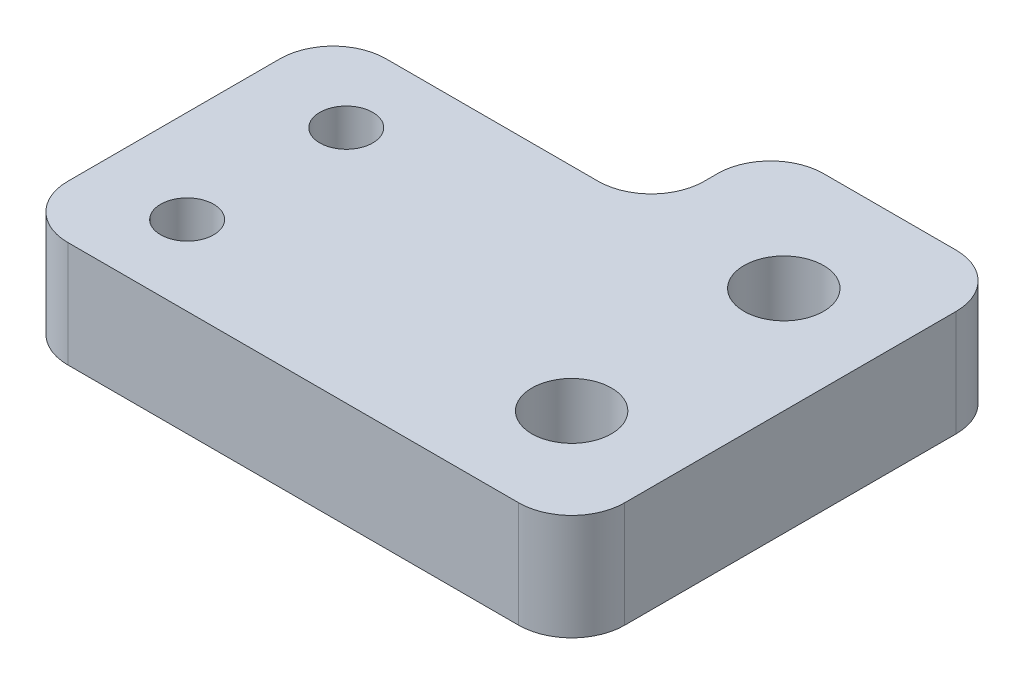
ISO-10303-21;
HEADER;
FILE_DESCRIPTION(('STEP AP214'),'2;1');
FILE_NAME('part.step','',(''),(''),'','','');
FILE_SCHEMA(('AUTOMOTIVE_DESIGN { 1 0 10303 214 1 1 1 1 }'));
ENDSEC;
DATA;
#1=APPLICATION_CONTEXT('core data for automotive mechanical design processes');
#2=APPLICATION_PROTOCOL_DEFINITION('international standard','automotive_design',2000,#1);
#3=PRODUCT_CONTEXT('',#1,'mechanical');
#4=PRODUCT('Part','Part','',(#3));
#5=PRODUCT_RELATED_PRODUCT_CATEGORY('part','',(#4));
#6=PRODUCT_DEFINITION_FORMATION('','',#4);
#7=PRODUCT_DEFINITION_CONTEXT('part definition',#1,'design');
#8=PRODUCT_DEFINITION('design','',#6,#7);
#9=PRODUCT_DEFINITION_SHAPE('','',#8);
#10=(LENGTH_UNIT() NAMED_UNIT(*) SI_UNIT(.MILLI.,.METRE.));
#11=(NAMED_UNIT(*) PLANE_ANGLE_UNIT() SI_UNIT($,.RADIAN.));
#12=(NAMED_UNIT(*) SI_UNIT($,.STERADIAN.) SOLID_ANGLE_UNIT());
#13=UNCERTAINTY_MEASURE_WITH_UNIT(LENGTH_MEASURE(1.E-05),#10,'distance_accuracy_value','');
#14=(GEOMETRIC_REPRESENTATION_CONTEXT(3) GLOBAL_UNCERTAINTY_ASSIGNED_CONTEXT((#13)) GLOBAL_UNIT_ASSIGNED_CONTEXT((#10,
#11,#12)) REPRESENTATION_CONTEXT('',''));
#15=CARTESIAN_POINT('',(0.,0.,0.));
#16=DIRECTION('',(0.,0.,1.));
#17=DIRECTION('',(1.,0.,0.));
#18=AXIS2_PLACEMENT_3D('',#15,#16,#17);
#19=CARTESIAN_POINT('',(-2.5,4.,0.));
#20=DIRECTION('',(-1.,0.,0.));
#21=DIRECTION('',(0.,0.,1.));
#22=AXIS2_PLACEMENT_3D('',#19,#20,#21);
#23=PLANE('',#22);
#24=DIRECTION('',(0.,0.,-1.));
#25=VECTOR('',#24,1.);
#26=CARTESIAN_POINT('',(-2.5,4.,0.));
#27=LINE('',#26,#25);
#28=CARTESIAN_POINT('',(-2.5,4.,-5.5));
#29=VERTEX_POINT('',#28);
#30=CARTESIAN_POINT('',(-2.5,4.,-6.));
#31=VERTEX_POINT('',#30);
#32=EDGE_CURVE('E179',#29,#31,#27,.T.);
#33=ORIENTED_EDGE('',*,*,#32,.T.);
#34=DIRECTION('',(0.,1.,0.));
#35=VECTOR('',#34,1.);
#36=CARTESIAN_POINT('',(-2.5,0.,-6.));
#37=LINE('',#36,#35);
#38=CARTESIAN_POINT('',(-2.5,0.,-6.));
#39=VERTEX_POINT('',#38);
#40=EDGE_CURVE('E58',#31,#39,#37,.F.);
#41=ORIENTED_EDGE('',*,*,#40,.T.);
#42=DIRECTION('',(0.,0.,-1.));
#43=VECTOR('',#42,1.);
#44=CARTESIAN_POINT('',(-2.5,0.,0.));
#45=LINE('',#44,#43);
#46=CARTESIAN_POINT('',(-2.5,0.,-5.5));
#47=VERTEX_POINT('',#46);
#48=EDGE_CURVE('E198',#47,#39,#45,.T.);
#49=ORIENTED_EDGE('',*,*,#48,.F.);
#50=DIRECTION('',(0.,-1.,0.));
#51=VECTOR('',#50,1.);
#52=CARTESIAN_POINT('',(-2.5,4.,-5.5));
#53=LINE('',#52,#51);
#54=EDGE_CURVE('E230',#47,#29,#53,.F.);
#55=ORIENTED_EDGE('',*,*,#54,.T.);
#56=EDGE_LOOP('',(#33,#41,#49,#55));
#57=FACE_BOUND('',#56,.T.);
#58=ADVANCED_FACE('F43',(#57),#23,.T.);
#59=CARTESIAN_POINT('',(0.,4.,-3.5));
#60=DIRECTION('',(0.,0.,-1.));
#61=DIRECTION('',(-1.,0.,0.));
#62=AXIS2_PLACEMENT_3D('',#59,#60,#61);
#63=PLANE('',#62);
#64=DIRECTION('',(1.,0.,0.));
#65=VECTOR('',#64,1.);
#66=CARTESIAN_POINT('',(0.,0.,-3.5));
#67=LINE('',#66,#65);
#68=CARTESIAN_POINT('',(-12.5,0.,-3.5));
#69=VERTEX_POINT('',#68);
#70=CARTESIAN_POINT('',(-4.5,0.,-3.5));
#71=VERTEX_POINT('',#70);
#72=EDGE_CURVE('E200',#69,#71,#67,.T.);
#73=ORIENTED_EDGE('',*,*,#72,.F.);
#74=DIRECTION('',(0.,-1.,0.));
#75=VECTOR('',#74,1.);
#76=CARTESIAN_POINT('',(-12.5,4.,-3.5));
#77=LINE('',#76,#75);
#78=CARTESIAN_POINT('',(-12.5,4.,-3.5));
#79=VERTEX_POINT('',#78);
#80=EDGE_CURVE('E247',#69,#79,#77,.F.);
#81=ORIENTED_EDGE('',*,*,#80,.T.);
#82=DIRECTION('',(1.,0.,0.));
#83=VECTOR('',#82,1.);
#84=CARTESIAN_POINT('',(0.,4.,-3.5));
#85=LINE('',#84,#83);
#86=CARTESIAN_POINT('',(-4.5,4.,-3.5));
#87=VERTEX_POINT('',#86);
#88=EDGE_CURVE('E181',#79,#87,#85,.T.);
#89=ORIENTED_EDGE('',*,*,#88,.T.);
#90=DIRECTION('',(0.,-1.,0.));
#91=VECTOR('',#90,1.);
#92=CARTESIAN_POINT('',(-4.5,0.,-3.5));
#93=LINE('',#92,#91);
#94=EDGE_CURVE('E244',#87,#71,#93,.T.);
#95=ORIENTED_EDGE('',*,*,#94,.T.);
#96=EDGE_LOOP('',(#73,#81,#89,#95));
#97=FACE_BOUND('',#96,.T.);
#98=ADVANCED_FACE('F252',(#97),#63,.T.);
#99=CARTESIAN_POINT('',(-14.5,4.,0.));
#100=DIRECTION('',(-1.,0.,0.));
#101=DIRECTION('',(0.,0.,1.));
#102=AXIS2_PLACEMENT_3D('',#99,#100,#101);
#103=PLANE('',#102);
#104=DIRECTION('',(0.,0.,-1.));
#105=VECTOR('',#104,1.);
#106=CARTESIAN_POINT('',(-14.5,0.,0.));
#107=LINE('',#106,#105);
#108=CARTESIAN_POINT('',(-14.5,0.,6.5));
#109=VERTEX_POINT('',#108);
#110=CARTESIAN_POINT('',(-14.5,0.,-1.5));
#111=VERTEX_POINT('',#110);
#112=EDGE_CURVE('E202',#109,#111,#107,.T.);
#113=ORIENTED_EDGE('',*,*,#112,.F.);
#114=DIRECTION('',(0.,-1.,0.));
#115=VECTOR('',#114,1.);
#116=CARTESIAN_POINT('',(-14.5,4.,6.5));
#117=LINE('',#116,#115);
#118=CARTESIAN_POINT('',(-14.5,4.,6.5));
#119=VERTEX_POINT('',#118);
#120=EDGE_CURVE('E242',#109,#119,#117,.F.);
#121=ORIENTED_EDGE('',*,*,#120,.T.);
#122=DIRECTION('',(0.,0.,-1.));
#123=VECTOR('',#122,1.);
#124=CARTESIAN_POINT('',(-14.5,4.,0.));
#125=LINE('',#124,#123);
#126=CARTESIAN_POINT('',(-14.5,4.,-1.5));
#127=VERTEX_POINT('',#126);
#128=EDGE_CURVE('E184',#119,#127,#125,.T.);
#129=ORIENTED_EDGE('',*,*,#128,.T.);
#130=DIRECTION('',(0.,-1.,0.));
#131=VECTOR('',#130,1.);
#132=CARTESIAN_POINT('',(-14.5,4.,-1.5));
#133=LINE('',#132,#131);
#134=EDGE_CURVE('E239',#127,#111,#133,.T.);
#135=ORIENTED_EDGE('',*,*,#134,.T.);
#136=EDGE_LOOP('',(#113,#121,#129,#135));
#137=FACE_BOUND('',#136,.T.);
#138=ADVANCED_FACE('F263',(#137),#103,.T.);
#139=CARTESIAN_POINT('',(0.,4.,8.5));
#140=DIRECTION('',(0.,0.,-1.));
#141=DIRECTION('',(-1.,0.,0.));
#142=AXIS2_PLACEMENT_3D('',#139,#140,#141);
#143=PLANE('',#142);
#144=DIRECTION('',(1.,0.,0.));
#145=VECTOR('',#144,1.);
#146=CARTESIAN_POINT('',(0.,4.,8.5));
#147=LINE('',#146,#145);
#148=CARTESIAN_POINT('',(-12.5,4.,8.5));
#149=VERTEX_POINT('',#148);
#150=CARTESIAN_POINT('',(4.5,4.,8.5));
#151=VERTEX_POINT('',#150);
#152=EDGE_CURVE('E187',#149,#151,#147,.T.);
#153=ORIENTED_EDGE('',*,*,#152,.F.);
#154=DIRECTION('',(0.,-1.,0.));
#155=VECTOR('',#154,1.);
#156=CARTESIAN_POINT('',(-12.5,0.,8.5));
#157=LINE('',#156,#155);
#158=CARTESIAN_POINT('',(-12.5,0.,8.5));
#159=VERTEX_POINT('',#158);
#160=EDGE_CURVE('E236',#149,#159,#157,.T.);
#161=ORIENTED_EDGE('',*,*,#160,.T.);
#162=DIRECTION('',(1.,0.,0.));
#163=VECTOR('',#162,1.);
#164=CARTESIAN_POINT('',(0.,0.,8.5));
#165=LINE('',#164,#163);
#166=CARTESIAN_POINT('',(4.5,0.,8.5));
#167=VERTEX_POINT('',#166);
#168=EDGE_CURVE('E170',#159,#167,#165,.T.);
#169=ORIENTED_EDGE('',*,*,#168,.T.);
#170=DIRECTION('',(0.,1.,0.));
#171=VECTOR('',#170,1.);
#172=CARTESIAN_POINT('',(4.5,4.,8.5));
#173=LINE('',#172,#171);
#174=EDGE_CURVE('E233',#167,#151,#173,.T.);
#175=ORIENTED_EDGE('',*,*,#174,.T.);
#176=EDGE_LOOP('',(#153,#161,#169,#175));
#177=FACE_BOUND('',#176,.T.);
#178=ADVANCED_FACE('F273',(#177),#143,.F.);
#179=CARTESIAN_POINT('',(2.5,4.,-3.5));
#180=DIRECTION('',(0.,-1.,0.));
#181=DIRECTION('',(0.,0.,-1.));
#182=AXIS2_PLACEMENT_3D('',#179,#180,#181);
#183=CYLINDRICAL_SURFACE('',#182,1.5);
#184=CARTESIAN_POINT('',(2.5,4.,-3.5));
#185=DIRECTION('',(0.,1.,0.));
#186=DIRECTION('',(0.,0.,1.));
#187=AXIS2_PLACEMENT_3D('',#184,#185,#186);
#188=CIRCLE('',#187,1.5);
#189=CARTESIAN_POINT('',(2.5,4.,-2.));
#190=VERTEX_POINT('',#189);
#191=EDGE_CURVE('E176',#190,#190,#188,.T.);
#192=ORIENTED_EDGE('',*,*,#191,.T.);
#193=EDGE_LOOP('',(#192));
#194=FACE_BOUND('',#193,.T.);
#195=CARTESIAN_POINT('',(2.5,0.,-3.5));
#196=DIRECTION('',(0.,1.,0.));
#197=DIRECTION('',(0.,0.,1.));
#198=AXIS2_PLACEMENT_3D('',#195,#196,#197);
#199=CIRCLE('',#198,1.5);
#200=CARTESIAN_POINT('',(2.5,0.,-2.));
#201=VERTEX_POINT('',#200);
#202=EDGE_CURVE('E195',#201,#201,#199,.T.);
#203=ORIENTED_EDGE('',*,*,#202,.F.);
#204=EDGE_LOOP('',(#203));
#205=FACE_BOUND('',#204,.T.);
#206=ADVANCED_FACE('F302',(#194,#205),#183,.F.);
#207=CARTESIAN_POINT('',(2.5,4.,4.5));
#208=DIRECTION('',(0.,-1.,0.));
#209=DIRECTION('',(0.,0.,-1.));
#210=AXIS2_PLACEMENT_3D('',#207,#208,#209);
#211=CYLINDRICAL_SURFACE('',#210,1.5);
#212=CARTESIAN_POINT('',(2.5,4.,4.5));
#213=DIRECTION('',(0.,1.,0.));
#214=DIRECTION('',(0.,0.,1.));
#215=AXIS2_PLACEMENT_3D('',#212,#213,#214);
#216=CIRCLE('',#215,1.5);
#217=CARTESIAN_POINT('',(2.5,4.,6.));
#218=VERTEX_POINT('',#217);
#219=EDGE_CURVE('E173',#218,#218,#216,.T.);
#220=ORIENTED_EDGE('',*,*,#219,.T.);
#221=EDGE_LOOP('',(#220));
#222=FACE_BOUND('',#221,.T.);
#223=CARTESIAN_POINT('',(2.5,0.,4.5));
#224=DIRECTION('',(0.,1.,0.));
#225=DIRECTION('',(0.,0.,1.));
#226=AXIS2_PLACEMENT_3D('',#223,#224,#225);
#227=CIRCLE('',#226,1.5);
#228=CARTESIAN_POINT('',(2.5,0.,6.));
#229=VERTEX_POINT('',#228);
#230=EDGE_CURVE('E192',#229,#229,#227,.T.);
#231=ORIENTED_EDGE('',*,*,#230,.F.);
#232=EDGE_LOOP('',(#231));
#233=FACE_BOUND('',#232,.T.);
#234=ADVANCED_FACE('F305',(#222,#233),#211,.F.);
#235=CARTESIAN_POINT('',(-11.,4.,-0.499999999999999));
#236=DIRECTION('',(0.,-1.,0.));
#237=DIRECTION('',(0.,0.,-1.));
#238=AXIS2_PLACEMENT_3D('',#235,#236,#237);
#239=CYLINDRICAL_SURFACE('',#238,1.);
#240=CARTESIAN_POINT('',(-11.,4.,-0.499999999999999));
#241=DIRECTION('',(0.,1.,0.));
#242=DIRECTION('',(0.,0.,1.));
#243=AXIS2_PLACEMENT_3D('',#240,#241,#242);
#244=CIRCLE('',#243,1.);
#245=CARTESIAN_POINT('',(-11.,4.,0.500000000000003));
#246=VERTEX_POINT('',#245);
#247=EDGE_CURVE('E169',#246,#246,#244,.T.);
#248=ORIENTED_EDGE('',*,*,#247,.T.);
#249=EDGE_LOOP('',(#248));
#250=FACE_BOUND('',#249,.T.);
#251=CARTESIAN_POINT('',(-11.,0.,-0.499999999999999));
#252=DIRECTION('',(0.,1.,0.));
#253=DIRECTION('',(0.,0.,1.));
#254=AXIS2_PLACEMENT_3D('',#251,#252,#253);
#255=CIRCLE('',#254,1.);
#256=CARTESIAN_POINT('',(-11.,0.,0.500000000000003));
#257=VERTEX_POINT('',#256);
#258=EDGE_CURVE('E162',#257,#257,#255,.T.);
#259=ORIENTED_EDGE('',*,*,#258,.F.);
#260=EDGE_LOOP('',(#259));
#261=FACE_BOUND('',#260,.T.);
#262=ADVANCED_FACE('F309',(#250,#261),#239,.F.);
#263=CARTESIAN_POINT('',(-11.,4.,5.5));
#264=DIRECTION('',(0.,-1.,0.));
#265=DIRECTION('',(0.,0.,-1.));
#266=AXIS2_PLACEMENT_3D('',#263,#264,#265);
#267=CYLINDRICAL_SURFACE('',#266,1.);
#268=CARTESIAN_POINT('',(-11.,4.,5.5));
#269=DIRECTION('',(0.,1.,0.));
#270=DIRECTION('',(0.,0.,1.));
#271=AXIS2_PLACEMENT_3D('',#268,#269,#270);
#272=CIRCLE('',#271,1.);
#273=CARTESIAN_POINT('',(-11.,4.,6.5));
#274=VERTEX_POINT('',#273);
#275=EDGE_CURVE('E166',#274,#274,#272,.T.);
#276=ORIENTED_EDGE('',*,*,#275,.T.);
#277=EDGE_LOOP('',(#276));
#278=FACE_BOUND('',#277,.T.);
#279=CARTESIAN_POINT('',(-11.,0.,5.5));
#280=DIRECTION('',(0.,1.,0.));
#281=DIRECTION('',(0.,0.,1.));
#282=AXIS2_PLACEMENT_3D('',#279,#280,#281);
#283=CIRCLE('',#282,1.);
#284=CARTESIAN_POINT('',(-11.,0.,6.5));
#285=VERTEX_POINT('',#284);
#286=EDGE_CURVE('E158',#285,#285,#283,.T.);
#287=ORIENTED_EDGE('',*,*,#286,.F.);
#288=EDGE_LOOP('',(#287));
#289=FACE_BOUND('',#288,.T.);
#290=ADVANCED_FACE('F313',(#278,#289),#267,.F.);
#291=CARTESIAN_POINT('',(0.,4.,0.));
#292=DIRECTION('',(0.,1.,0.));
#293=DIRECTION('',(0.,0.,1.));
#294=AXIS2_PLACEMENT_3D('',#291,#292,#293);
#295=PLANE('',#294);
#296=DIRECTION('',(0.,0.,1.));
#297=VECTOR('',#296,1.);
#298=CARTESIAN_POINT('',(6.5,4.,0.));
#299=LINE('',#298,#297);
#300=CARTESIAN_POINT('',(6.5,4.,-6.));
#301=VERTEX_POINT('',#300);
#302=CARTESIAN_POINT('',(6.5,4.,6.5));
#303=VERTEX_POINT('',#302);
#304=EDGE_CURVE('E148',#301,#303,#299,.T.);
#305=ORIENTED_EDGE('',*,*,#304,.F.);
#306=CARTESIAN_POINT('',(4.5,4.,-6.));
#307=DIRECTION('',(0.,1.,0.));
#308=DIRECTION('',(0.,0.,1.));
#309=AXIS2_PLACEMENT_3D('',#306,#307,#308);
#310=CIRCLE('',#309,2.);
#311=CARTESIAN_POINT('',(4.5,4.,-8.));
#312=VERTEX_POINT('',#311);
#313=EDGE_CURVE('E131',#301,#312,#310,.T.);
#314=ORIENTED_EDGE('',*,*,#313,.T.);
#315=DIRECTION('',(1.,0.,0.));
#316=VECTOR('',#315,1.);
#317=CARTESIAN_POINT('',(0.,4.,-8.));
#318=LINE('',#317,#316);
#319=CARTESIAN_POINT('',(-0.500000000000002,4.,-8.));
#320=VERTEX_POINT('',#319);
#321=EDGE_CURVE('E159',#320,#312,#318,.T.);
#322=ORIENTED_EDGE('',*,*,#321,.F.);
#323=CARTESIAN_POINT('',(-0.500000000000002,4.,-6.));
#324=DIRECTION('',(0.,1.,0.));
#325=DIRECTION('',(0.,0.,1.));
#326=AXIS2_PLACEMENT_3D('',#323,#324,#325);
#327=CIRCLE('',#326,2.);
#328=EDGE_CURVE('E142',#320,#31,#327,.T.);
#329=ORIENTED_EDGE('',*,*,#328,.T.);
#330=ORIENTED_EDGE('',*,*,#32,.F.);
#331=CARTESIAN_POINT('',(-4.5,4.,-5.5));
#332=DIRECTION('',(0.,1.,0.));
#333=DIRECTION('',(0.,0.,1.));
#334=AXIS2_PLACEMENT_3D('',#331,#332,#333);
#335=CIRCLE('',#334,2.);
#336=EDGE_CURVE('E11',#29,#87,#335,.F.);
#337=ORIENTED_EDGE('',*,*,#336,.T.);
#338=ORIENTED_EDGE('',*,*,#88,.F.);
#339=CARTESIAN_POINT('',(-12.5,4.,-1.5));
#340=DIRECTION('',(0.,1.,0.));
#341=DIRECTION('',(0.,0.,1.));
#342=AXIS2_PLACEMENT_3D('',#339,#340,#341);
#343=CIRCLE('',#342,2.);
#344=EDGE_CURVE('E212',#79,#127,#343,.T.);
#345=ORIENTED_EDGE('',*,*,#344,.T.);
#346=ORIENTED_EDGE('',*,*,#128,.F.);
#347=CARTESIAN_POINT('',(-12.5,4.,6.5));
#348=DIRECTION('',(0.,1.,0.));
#349=DIRECTION('',(0.,0.,1.));
#350=AXIS2_PLACEMENT_3D('',#347,#348,#349);
#351=CIRCLE('',#350,2.);
#352=EDGE_CURVE('E214',#119,#149,#351,.T.);
#353=ORIENTED_EDGE('',*,*,#352,.T.);
#354=ORIENTED_EDGE('',*,*,#152,.T.);
#355=CARTESIAN_POINT('',(4.5,4.,6.5));
#356=DIRECTION('',(0.,1.,0.));
#357=DIRECTION('',(0.,0.,1.));
#358=AXIS2_PLACEMENT_3D('',#355,#356,#357);
#359=CIRCLE('',#358,2.);
#360=EDGE_CURVE('E152',#151,#303,#359,.T.);
#361=ORIENTED_EDGE('',*,*,#360,.T.);
#362=EDGE_LOOP('',(#305,#314,#322,#329,#330,#337,#338,#345,#346,#353,#354,#361));
#363=FACE_BOUND('',#362,.T.);
#364=ORIENTED_EDGE('',*,*,#275,.F.);
#365=EDGE_LOOP('',(#364));
#366=FACE_BOUND('',#365,.T.);
#367=ORIENTED_EDGE('',*,*,#247,.F.);
#368=EDGE_LOOP('',(#367));
#369=FACE_BOUND('',#368,.T.);
#370=ORIENTED_EDGE('',*,*,#219,.F.);
#371=EDGE_LOOP('',(#370));
#372=FACE_BOUND('',#371,.T.);
#373=ORIENTED_EDGE('',*,*,#191,.F.);
#374=EDGE_LOOP('',(#373));
#375=FACE_BOUND('',#374,.T.);
#376=ADVANCED_FACE('F155',(#363,#366,#369,#372,#375),#295,.T.);
#377=CARTESIAN_POINT('',(0.,0.,0.));
#378=DIRECTION('',(0.,1.,0.));
#379=DIRECTION('',(0.,0.,1.));
#380=AXIS2_PLACEMENT_3D('',#377,#378,#379);
#381=PLANE('',#380);
#382=ORIENTED_EDGE('',*,*,#286,.T.);
#383=EDGE_LOOP('',(#382));
#384=FACE_BOUND('',#383,.T.);
#385=ORIENTED_EDGE('',*,*,#258,.T.);
#386=EDGE_LOOP('',(#385));
#387=FACE_BOUND('',#386,.T.);
#388=ORIENTED_EDGE('',*,*,#230,.T.);
#389=EDGE_LOOP('',(#388));
#390=FACE_BOUND('',#389,.T.);
#391=ORIENTED_EDGE('',*,*,#202,.T.);
#392=EDGE_LOOP('',(#391));
#393=FACE_BOUND('',#392,.T.);
#394=DIRECTION('',(1.,0.,0.));
#395=VECTOR('',#394,1.);
#396=CARTESIAN_POINT('',(0.,0.,-8.));
#397=LINE('',#396,#395);
#398=CARTESIAN_POINT('',(-0.500000000000002,0.,-8.));
#399=VERTEX_POINT('',#398);
#400=CARTESIAN_POINT('',(4.5,0.,-8.));
#401=VERTEX_POINT('',#400);
#402=EDGE_CURVE('E188',#399,#401,#397,.T.);
#403=ORIENTED_EDGE('',*,*,#402,.T.);
#404=CARTESIAN_POINT('',(4.5,0.,-6.));
#405=DIRECTION('',(0.,1.,0.));
#406=DIRECTION('',(0.,0.,1.));
#407=AXIS2_PLACEMENT_3D('',#404,#405,#406);
#408=CIRCLE('',#407,2.);
#409=CARTESIAN_POINT('',(6.5,0.,-6.));
#410=VERTEX_POINT('',#409);
#411=EDGE_CURVE('E228',#401,#410,#408,.F.);
#412=ORIENTED_EDGE('',*,*,#411,.T.);
#413=DIRECTION('',(0.,0.,1.));
#414=VECTOR('',#413,1.);
#415=CARTESIAN_POINT('',(6.5,0.,0.));
#416=LINE('',#415,#414);
#417=CARTESIAN_POINT('',(6.5,0.,6.5));
#418=VERTEX_POINT('',#417);
#419=EDGE_CURVE('E151',#410,#418,#416,.T.);
#420=ORIENTED_EDGE('',*,*,#419,.T.);
#421=CARTESIAN_POINT('',(4.5,0.,6.5));
#422=DIRECTION('',(0.,1.,0.));
#423=DIRECTION('',(0.,0.,1.));
#424=AXIS2_PLACEMENT_3D('',#421,#422,#423);
#425=CIRCLE('',#424,2.);
#426=EDGE_CURVE('E220',#418,#167,#425,.F.);
#427=ORIENTED_EDGE('',*,*,#426,.T.);
#428=ORIENTED_EDGE('',*,*,#168,.F.);
#429=CARTESIAN_POINT('',(-12.5,0.,6.5));
#430=DIRECTION('',(0.,1.,0.));
#431=DIRECTION('',(0.,0.,1.));
#432=AXIS2_PLACEMENT_3D('',#429,#430,#431);
#433=CIRCLE('',#432,2.);
#434=EDGE_CURVE('E224',#159,#109,#433,.F.);
#435=ORIENTED_EDGE('',*,*,#434,.T.);
#436=ORIENTED_EDGE('',*,*,#112,.T.);
#437=CARTESIAN_POINT('',(-12.5,0.,-1.5));
#438=DIRECTION('',(0.,1.,0.));
#439=DIRECTION('',(0.,0.,1.));
#440=AXIS2_PLACEMENT_3D('',#437,#438,#439);
#441=CIRCLE('',#440,2.);
#442=EDGE_CURVE('E222',#111,#69,#441,.F.);
#443=ORIENTED_EDGE('',*,*,#442,.T.);
#444=ORIENTED_EDGE('',*,*,#72,.T.);
#445=CARTESIAN_POINT('',(-4.5,0.,-5.5));
#446=DIRECTION('',(0.,1.,0.));
#447=DIRECTION('',(0.,0.,1.));
#448=AXIS2_PLACEMENT_3D('',#445,#446,#447);
#449=CIRCLE('',#448,2.);
#450=EDGE_CURVE('E51',#71,#47,#449,.T.);
#451=ORIENTED_EDGE('',*,*,#450,.T.);
#452=ORIENTED_EDGE('',*,*,#48,.T.);
#453=CARTESIAN_POINT('',(-0.500000000000002,0.,-6.));
#454=DIRECTION('',(0.,1.,0.));
#455=DIRECTION('',(0.,0.,1.));
#456=AXIS2_PLACEMENT_3D('',#453,#454,#455);
#457=CIRCLE('',#456,2.);
#458=EDGE_CURVE('E226',#39,#399,#457,.F.);
#459=ORIENTED_EDGE('',*,*,#458,.T.);
#460=EDGE_LOOP('',(#403,#412,#420,#427,#428,#435,#436,#443,#444,#451,#452,#459));
#461=FACE_BOUND('',#460,.T.);
#462=ADVANCED_FACE('F265',(#384,#387,#390,#393,#461),#381,.F.);
#463=CARTESIAN_POINT('',(6.5,-6.,0.));
#464=DIRECTION('',(-1.,0.,0.));
#465=DIRECTION('',(0.,0.,1.));
#466=AXIS2_PLACEMENT_3D('',#463,#464,#465);
#467=PLANE('',#466);
#468=ORIENTED_EDGE('',*,*,#419,.F.);
#469=DIRECTION('',(0.,1.,0.));
#470=VECTOR('',#469,1.);
#471=CARTESIAN_POINT('',(6.5,-6.,-6.));
#472=LINE('',#471,#470);
#473=EDGE_CURVE('E135',#410,#301,#472,.T.);
#474=ORIENTED_EDGE('',*,*,#473,.T.);
#475=ORIENTED_EDGE('',*,*,#304,.T.);
#476=DIRECTION('',(0.,1.,0.));
#477=VECTOR('',#476,1.);
#478=CARTESIAN_POINT('',(6.5,-6.,6.5));
#479=LINE('',#478,#477);
#480=EDGE_CURVE('E153',#303,#418,#479,.F.);
#481=ORIENTED_EDGE('',*,*,#480,.T.);
#482=EDGE_LOOP('',(#468,#474,#475,#481));
#483=FACE_BOUND('',#482,.T.);
#484=ADVANCED_FACE('F147',(#483),#467,.F.);
#485=CARTESIAN_POINT('',(0.,-6.,-8.));
#486=DIRECTION('',(0.,0.,1.));
#487=DIRECTION('',(1.,0.,0.));
#488=AXIS2_PLACEMENT_3D('',#485,#486,#487);
#489=PLANE('',#488);
#490=ORIENTED_EDGE('',*,*,#321,.T.);
#491=DIRECTION('',(0.,1.,0.));
#492=VECTOR('',#491,1.);
#493=CARTESIAN_POINT('',(4.5,-6.,-8.));
#494=LINE('',#493,#492);
#495=EDGE_CURVE('E136',#312,#401,#494,.F.);
#496=ORIENTED_EDGE('',*,*,#495,.T.);
#497=ORIENTED_EDGE('',*,*,#402,.F.);
#498=DIRECTION('',(0.,1.,0.));
#499=VECTOR('',#498,1.);
#500=CARTESIAN_POINT('',(-0.500000000000002,4.,-8.));
#501=LINE('',#500,#499);
#502=EDGE_CURVE('E141',#399,#320,#501,.T.);
#503=ORIENTED_EDGE('',*,*,#502,.T.);
#504=EDGE_LOOP('',(#490,#496,#497,#503));
#505=FACE_BOUND('',#504,.T.);
#506=ADVANCED_FACE('F281',(#505),#489,.F.);
#507=CARTESIAN_POINT('',(4.5,-6.,-6.));
#508=DIRECTION('',(0.,1.,0.));
#509=DIRECTION('',(0.,0.,1.));
#510=AXIS2_PLACEMENT_3D('',#507,#508,#509);
#511=CYLINDRICAL_SURFACE('',#510,2.);
#512=ORIENTED_EDGE('',*,*,#411,.F.);
#513=ORIENTED_EDGE('',*,*,#495,.F.);
#514=ORIENTED_EDGE('',*,*,#313,.F.);
#515=ORIENTED_EDGE('',*,*,#473,.F.);
#516=EDGE_LOOP('',(#512,#513,#514,#515));
#517=FACE_BOUND('',#516,.T.);
#518=ADVANCED_FACE('F134',(#517),#511,.T.);
#519=CARTESIAN_POINT('',(-0.500000000000002,-6.,-6.));
#520=DIRECTION('',(0.,-1.,0.));
#521=DIRECTION('',(0.,0.,-1.));
#522=AXIS2_PLACEMENT_3D('',#519,#520,#521);
#523=CYLINDRICAL_SURFACE('',#522,2.);
#524=ORIENTED_EDGE('',*,*,#458,.F.);
#525=ORIENTED_EDGE('',*,*,#40,.F.);
#526=ORIENTED_EDGE('',*,*,#328,.F.);
#527=ORIENTED_EDGE('',*,*,#502,.F.);
#528=EDGE_LOOP('',(#524,#525,#526,#527));
#529=FACE_BOUND('',#528,.T.);
#530=ADVANCED_FACE('F283',(#529),#523,.T.);
#531=CARTESIAN_POINT('',(-12.5,4.,6.5));
#532=DIRECTION('',(0.,1.,0.));
#533=DIRECTION('',(0.,0.,1.));
#534=AXIS2_PLACEMENT_3D('',#531,#532,#533);
#535=CYLINDRICAL_SURFACE('',#534,2.);
#536=ORIENTED_EDGE('',*,*,#352,.F.);
#537=ORIENTED_EDGE('',*,*,#120,.F.);
#538=ORIENTED_EDGE('',*,*,#434,.F.);
#539=ORIENTED_EDGE('',*,*,#160,.F.);
#540=EDGE_LOOP('',(#536,#537,#538,#539));
#541=FACE_BOUND('',#540,.T.);
#542=ADVANCED_FACE('F270',(#541),#535,.T.);
#543=CARTESIAN_POINT('',(-12.5,4.,-1.5));
#544=DIRECTION('',(0.,-1.,0.));
#545=DIRECTION('',(0.,0.,-1.));
#546=AXIS2_PLACEMENT_3D('',#543,#544,#545);
#547=CYLINDRICAL_SURFACE('',#546,2.);
#548=ORIENTED_EDGE('',*,*,#344,.F.);
#549=ORIENTED_EDGE('',*,*,#80,.F.);
#550=ORIENTED_EDGE('',*,*,#442,.F.);
#551=ORIENTED_EDGE('',*,*,#134,.F.);
#552=EDGE_LOOP('',(#548,#549,#550,#551));
#553=FACE_BOUND('',#552,.T.);
#554=ADVANCED_FACE('F260',(#553),#547,.T.);
#555=CARTESIAN_POINT('',(-4.5,4.,-5.5));
#556=DIRECTION('',(0.,1.,0.));
#557=DIRECTION('',(0.,0.,1.));
#558=AXIS2_PLACEMENT_3D('',#555,#556,#557);
#559=CYLINDRICAL_SURFACE('',#558,2.);
#560=ORIENTED_EDGE('',*,*,#336,.F.);
#561=ORIENTED_EDGE('',*,*,#54,.F.);
#562=ORIENTED_EDGE('',*,*,#450,.F.);
#563=ORIENTED_EDGE('',*,*,#94,.F.);
#564=EDGE_LOOP('',(#560,#561,#562,#563));
#565=FACE_BOUND('',#564,.T.);
#566=ADVANCED_FACE('F286',(#565),#559,.F.);
#567=CARTESIAN_POINT('',(4.5,4.,6.5));
#568=DIRECTION('',(0.,1.,0.));
#569=DIRECTION('',(0.,0.,1.));
#570=AXIS2_PLACEMENT_3D('',#567,#568,#569);
#571=CYLINDRICAL_SURFACE('',#570,2.);
#572=ORIENTED_EDGE('',*,*,#426,.F.);
#573=ORIENTED_EDGE('',*,*,#480,.F.);
#574=ORIENTED_EDGE('',*,*,#360,.F.);
#575=ORIENTED_EDGE('',*,*,#174,.F.);
#576=EDGE_LOOP('',(#572,#573,#574,#575));
#577=FACE_BOUND('',#576,.T.);
#578=ADVANCED_FACE('F45',(#577),#571,.T.);
#579=CLOSED_SHELL('',(#58,#98,#138,#178,#206,#234,#262,#290,#376,#462,#484,#506,#518,#530,#542,
#554,#566,#578));
#580=MANIFOLD_SOLID_BREP('B2',#579);
#581=ADVANCED_BREP_SHAPE_REPRESENTATION('',(#18,#580),#14);
#582=SHAPE_DEFINITION_REPRESENTATION(#9,#581);
ENDSEC;
END-ISO-10303-21;
